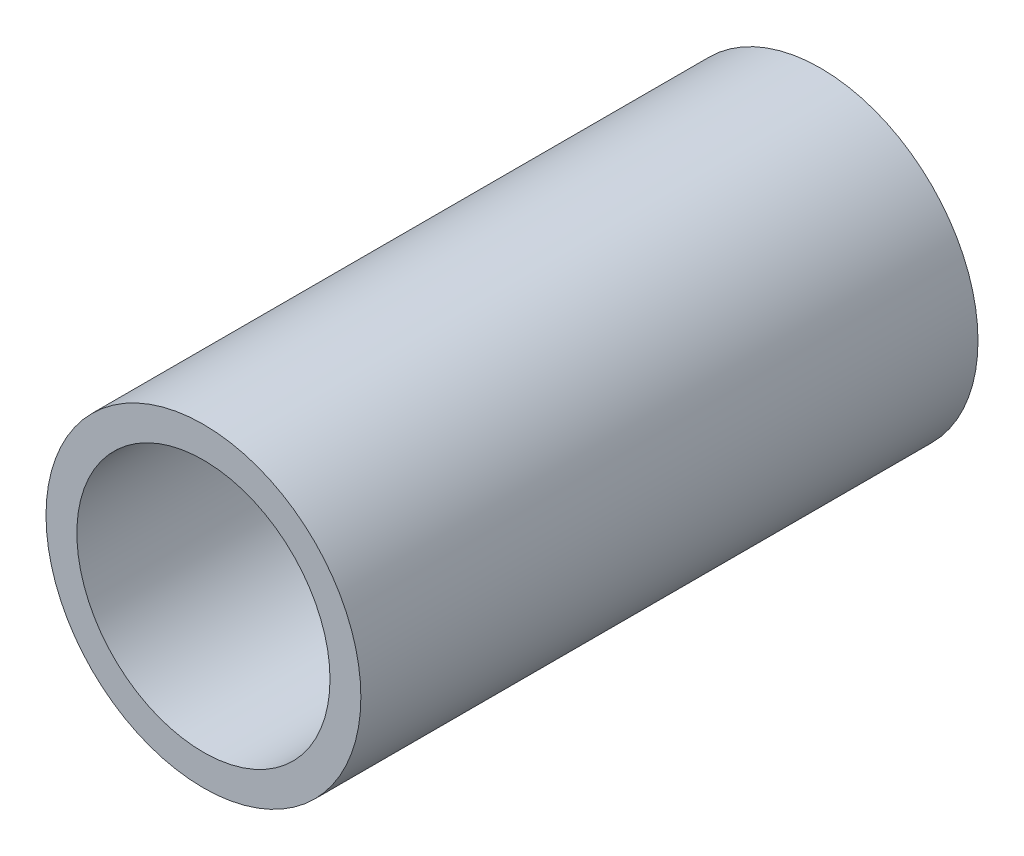
ISO-10303-21;
HEADER;
FILE_DESCRIPTION(('STEP AP214'),'2;1');
FILE_NAME('part.step','',(''),(''),'','','');
FILE_SCHEMA(('AUTOMOTIVE_DESIGN { 1 0 10303 214 1 1 1 1 }'));
ENDSEC;
DATA;
#1=APPLICATION_CONTEXT('core data for automotive mechanical design processes');
#2=APPLICATION_PROTOCOL_DEFINITION('international standard','automotive_design',2000,#1);
#3=PRODUCT_CONTEXT('',#1,'mechanical');
#4=PRODUCT('Part','Part','',(#3));
#5=PRODUCT_RELATED_PRODUCT_CATEGORY('part','',(#4));
#6=PRODUCT_DEFINITION_FORMATION('','',#4);
#7=PRODUCT_DEFINITION_CONTEXT('part definition',#1,'design');
#8=PRODUCT_DEFINITION('design','',#6,#7);
#9=PRODUCT_DEFINITION_SHAPE('','',#8);
#10=(LENGTH_UNIT() NAMED_UNIT(*) SI_UNIT(.MILLI.,.METRE.));
#11=(NAMED_UNIT(*) PLANE_ANGLE_UNIT() SI_UNIT($,.RADIAN.));
#12=(NAMED_UNIT(*) SI_UNIT($,.STERADIAN.) SOLID_ANGLE_UNIT());
#13=UNCERTAINTY_MEASURE_WITH_UNIT(LENGTH_MEASURE(1.E-05),#10,'distance_accuracy_value','');
#14=(GEOMETRIC_REPRESENTATION_CONTEXT(3) GLOBAL_UNCERTAINTY_ASSIGNED_CONTEXT((#13)) GLOBAL_UNIT_ASSIGNED_CONTEXT((#10,
#11,#12)) REPRESENTATION_CONTEXT('',''));
#15=CARTESIAN_POINT('',(0.,0.,0.));
#16=DIRECTION('',(0.,0.,1.));
#17=DIRECTION('',(1.,0.,0.));
#18=AXIS2_PLACEMENT_3D('',#15,#16,#17);
#19=CARTESIAN_POINT('',(0.,0.,12.446));
#20=DIRECTION('',(0.,0.,1.));
#21=DIRECTION('',(1.,0.,0.));
#22=AXIS2_PLACEMENT_3D('',#19,#20,#21);
#23=PLANE('',#22);
#24=CARTESIAN_POINT('',(0.,0.,12.446));
#25=DIRECTION('',(0.,0.,1.));
#26=DIRECTION('',(1.,0.,0.));
#27=AXIS2_PLACEMENT_3D('',#24,#25,#26);
#28=CIRCLE('',#27,6.35);
#29=CARTESIAN_POINT('',(6.35,0.,12.446));
#30=VERTEX_POINT('',#29);
#31=EDGE_CURVE('E10',#30,#30,#28,.T.);
#32=ORIENTED_EDGE('',*,*,#31,.T.);
#33=EDGE_LOOP('',(#32));
#34=FACE_BOUND('',#33,.T.);
#35=CARTESIAN_POINT('',(0.,0.,12.446));
#36=DIRECTION('',(0.,0.,1.));
#37=DIRECTION('',(1.,0.,0.));
#38=AXIS2_PLACEMENT_3D('',#35,#36,#37);
#39=CIRCLE('',#38,5.1054);
#40=CARTESIAN_POINT('',(5.1054,0.,12.446));
#41=VERTEX_POINT('',#40);
#42=EDGE_CURVE('E46',#41,#41,#39,.T.);
#43=ORIENTED_EDGE('',*,*,#42,.F.);
#44=EDGE_LOOP('',(#43));
#45=FACE_BOUND('',#44,.T.);
#46=ADVANCED_FACE('F39',(#34,#45),#23,.T.);
#47=CARTESIAN_POINT('',(0.,0.,12.446));
#48=DIRECTION('',(0.,0.,-1.));
#49=DIRECTION('',(-1.,0.,0.));
#50=AXIS2_PLACEMENT_3D('',#47,#48,#49);
#51=CYLINDRICAL_SURFACE('',#50,6.35);
#52=ORIENTED_EDGE('',*,*,#31,.F.);
#53=EDGE_LOOP('',(#52));
#54=FACE_BOUND('',#53,.T.);
#55=CARTESIAN_POINT('',(0.,0.,-12.446));
#56=DIRECTION('',(0.,0.,1.));
#57=DIRECTION('',(1.,0.,0.));
#58=AXIS2_PLACEMENT_3D('',#55,#56,#57);
#59=CIRCLE('',#58,6.35);
#60=CARTESIAN_POINT('',(6.35,0.,-12.446));
#61=VERTEX_POINT('',#60);
#62=EDGE_CURVE('E50',#61,#61,#59,.T.);
#63=ORIENTED_EDGE('',*,*,#62,.T.);
#64=EDGE_LOOP('',(#63));
#65=FACE_BOUND('',#64,.T.);
#66=ADVANCED_FACE('F41',(#54,#65),#51,.T.);
#67=CARTESIAN_POINT('',(0.,0.,12.446));
#68=DIRECTION('',(0.,0.,-1.));
#69=DIRECTION('',(-1.,0.,0.));
#70=AXIS2_PLACEMENT_3D('',#67,#68,#69);
#71=CYLINDRICAL_SURFACE('',#70,5.1054);
#72=ORIENTED_EDGE('',*,*,#42,.T.);
#73=EDGE_LOOP('',(#72));
#74=FACE_BOUND('',#73,.T.);
#75=CARTESIAN_POINT('',(0.,0.,-12.446));
#76=DIRECTION('',(0.,0.,1.));
#77=DIRECTION('',(1.,0.,0.));
#78=AXIS2_PLACEMENT_3D('',#75,#76,#77);
#79=CIRCLE('',#78,5.1054);
#80=CARTESIAN_POINT('',(5.1054,0.,-12.446));
#81=VERTEX_POINT('',#80);
#82=EDGE_CURVE('E54',#81,#81,#79,.T.);
#83=ORIENTED_EDGE('',*,*,#82,.F.);
#84=EDGE_LOOP('',(#83));
#85=FACE_BOUND('',#84,.T.);
#86=ADVANCED_FACE('F63',(#74,#85),#71,.F.);
#87=CARTESIAN_POINT('',(0.,0.,-12.446));
#88=DIRECTION('',(0.,0.,1.));
#89=DIRECTION('',(1.,0.,0.));
#90=AXIS2_PLACEMENT_3D('',#87,#88,#89);
#91=PLANE('',#90);
#92=ORIENTED_EDGE('',*,*,#82,.T.);
#93=EDGE_LOOP('',(#92));
#94=FACE_BOUND('',#93,.T.);
#95=ORIENTED_EDGE('',*,*,#62,.F.);
#96=EDGE_LOOP('',(#95));
#97=FACE_BOUND('',#96,.T.);
#98=ADVANCED_FACE('F60',(#94,#97),#91,.F.);
#99=CLOSED_SHELL('',(#46,#66,#86,#98));
#100=MANIFOLD_SOLID_BREP('B2',#99);
#101=ADVANCED_BREP_SHAPE_REPRESENTATION('',(#18,#100),#14);
#102=SHAPE_DEFINITION_REPRESENTATION(#9,#101);
ENDSEC;
END-ISO-10303-21;
